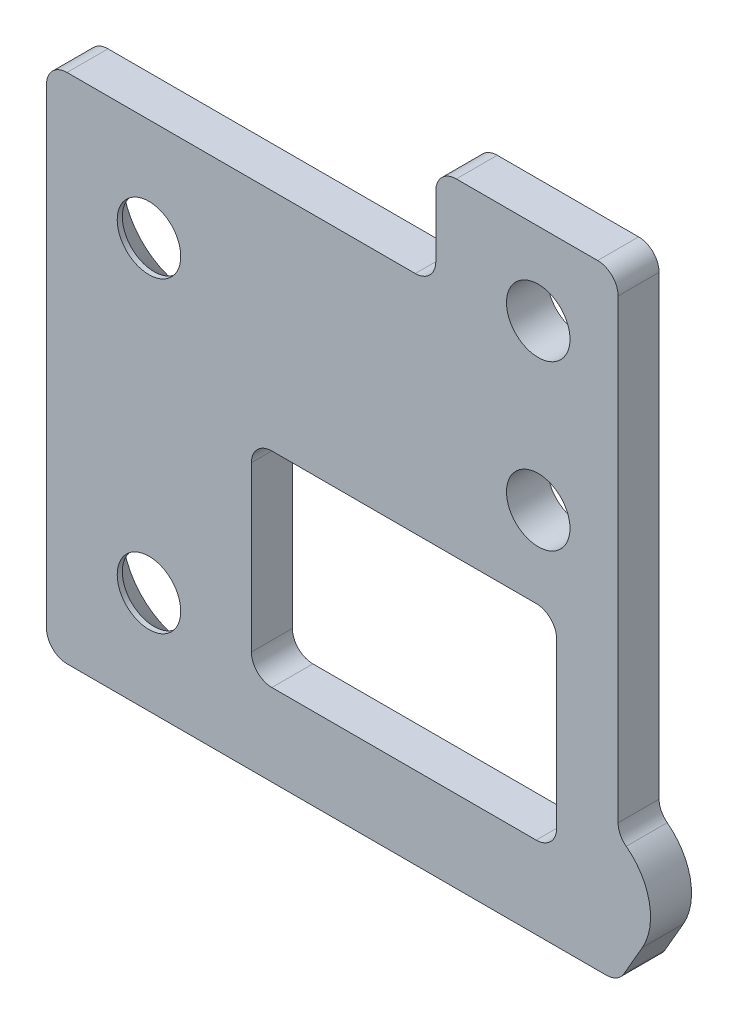
ISO-10303-21;
HEADER;
FILE_DESCRIPTION(('STEP AP214'),'2;1');
FILE_NAME('part.step','',(''),(''),'','','');
FILE_SCHEMA(('AUTOMOTIVE_DESIGN { 1 0 10303 214 1 1 1 1 }'));
ENDSEC;
DATA;
#1=APPLICATION_CONTEXT('core data for automotive mechanical design processes');
#2=APPLICATION_PROTOCOL_DEFINITION('international standard','automotive_design',2000,#1);
#3=PRODUCT_CONTEXT('',#1,'mechanical');
#4=PRODUCT('Part','Part','',(#3));
#5=PRODUCT_RELATED_PRODUCT_CATEGORY('part','',(#4));
#6=PRODUCT_DEFINITION_FORMATION('','',#4);
#7=PRODUCT_DEFINITION_CONTEXT('part definition',#1,'design');
#8=PRODUCT_DEFINITION('design','',#6,#7);
#9=PRODUCT_DEFINITION_SHAPE('','',#8);
#10=(LENGTH_UNIT() NAMED_UNIT(*) SI_UNIT(.MILLI.,.METRE.));
#11=(NAMED_UNIT(*) PLANE_ANGLE_UNIT() SI_UNIT($,.RADIAN.));
#12=(NAMED_UNIT(*) SI_UNIT($,.STERADIAN.) SOLID_ANGLE_UNIT());
#13=UNCERTAINTY_MEASURE_WITH_UNIT(LENGTH_MEASURE(1.E-05),#10,'distance_accuracy_value','');
#14=(GEOMETRIC_REPRESENTATION_CONTEXT(3) GLOBAL_UNCERTAINTY_ASSIGNED_CONTEXT((#13)) GLOBAL_UNIT_ASSIGNED_CONTEXT((#10,
#11,#12)) REPRESENTATION_CONTEXT('',''));
#15=CARTESIAN_POINT('',(0.,0.,0.));
#16=DIRECTION('',(0.,0.,1.));
#17=DIRECTION('',(1.,0.,0.));
#18=AXIS2_PLACEMENT_3D('',#15,#16,#17);
#19=CARTESIAN_POINT('',(0.,0.,0.));
#20=DIRECTION('',(0.,0.,1.));
#21=DIRECTION('',(1.,0.,0.));
#22=AXIS2_PLACEMENT_3D('',#19,#20,#21);
#23=PLANE('',#22);
#24=CARTESIAN_POINT('',(-4.49999999999999,-7.5,0.));
#25=DIRECTION('',(0.,0.,-1.));
#26=DIRECTION('',(-1.,0.,0.));
#27=AXIS2_PLACEMENT_3D('',#24,#25,#26);
#28=CIRCLE('',#27,3.3);
#29=CARTESIAN_POINT('',(-7.79999999999999,-7.5,0.));
#30=VERTEX_POINT('',#29);
#31=EDGE_CURVE('E688',#30,#30,#28,.T.);
#32=ORIENTED_EDGE('',*,*,#31,.F.);
#33=EDGE_LOOP('',(#32));
#34=FACE_BOUND('',#33,.T.);
#35=CARTESIAN_POINT('',(14.5,5.5,0.));
#36=DIRECTION('',(0.,0.,1.));
#37=DIRECTION('',(1.,0.,0.));
#38=AXIS2_PLACEMENT_3D('',#35,#36,#37);
#39=CIRCLE('',#38,1.55);
#40=CARTESIAN_POINT('',(16.05,5.5,0.));
#41=VERTEX_POINT('',#40);
#42=EDGE_CURVE('E670',#41,#41,#39,.T.);
#43=ORIENTED_EDGE('',*,*,#42,.T.);
#44=EDGE_LOOP('',(#43));
#45=FACE_BOUND('',#44,.T.);
#46=CARTESIAN_POINT('',(14.5,13.5,0.));
#47=DIRECTION('',(0.,0.,1.));
#48=DIRECTION('',(1.,0.,0.));
#49=AXIS2_PLACEMENT_3D('',#46,#47,#48);
#50=CIRCLE('',#49,1.55);
#51=CARTESIAN_POINT('',(16.05,13.5,0.));
#52=VERTEX_POINT('',#51);
#53=EDGE_CURVE('E356',#52,#52,#50,.T.);
#54=ORIENTED_EDGE('',*,*,#53,.T.);
#55=EDGE_LOOP('',(#54));
#56=FACE_BOUND('',#55,.T.);
#57=CARTESIAN_POINT('',(19.4,-5.76794919243113,0.));
#58=DIRECTION('',(0.,0.,1.));
#59=DIRECTION('',(1.,0.,0.));
#60=AXIS2_PLACEMENT_3D('',#57,#58,#59);
#61=CIRCLE('',#60,1.);
#62=CARTESIAN_POINT('',(18.4,-5.76794919243113,0.));
#63=VERTEX_POINT('',#62);
#64=CARTESIAN_POINT('',(18.7956684537023,-6.56468213523535,0.));
#65=VERTEX_POINT('',#64);
#66=EDGE_CURVE('E308',#63,#65,#61,.T.);
#67=ORIENTED_EDGE('',*,*,#66,.T.);
#68=CARTESIAN_POINT('',(16.9826738148093,-8.954880963648,0.));
#69=DIRECTION('',(0.,0.,1.));
#70=DIRECTION('',(1.,0.,0.));
#71=AXIS2_PLACEMENT_3D('',#68,#69,#70);
#72=CIRCLE('',#71,3.);
#73=CARTESIAN_POINT('',(19.5807500261627,-10.454880963648,0.));
#74=VERTEX_POINT('',#73);
#75=EDGE_CURVE('E56',#65,#74,#72,.F.);
#76=ORIENTED_EDGE('',*,*,#75,.T.);
#77=DIRECTION('',(0.499999999999998,0.86602540378444,0.));
#78=VECTOR('',#77,1.);
#79=CARTESIAN_POINT('',(18.4,-12.5,0.));
#80=LINE('',#79,#78);
#81=CARTESIAN_POINT('',(18.6886751345948,-12.,0.));
#82=VERTEX_POINT('',#81);
#83=EDGE_CURVE('E329',#82,#74,#80,.T.);
#84=ORIENTED_EDGE('',*,*,#83,.F.);
#85=CARTESIAN_POINT('',(17.8226497308104,-11.5,0.));
#86=DIRECTION('',(0.,0.,1.));
#87=DIRECTION('',(1.,0.,0.));
#88=AXIS2_PLACEMENT_3D('',#85,#86,#87);
#89=CIRCLE('',#88,1.);
#90=CARTESIAN_POINT('',(17.8226497308104,-12.5,0.));
#91=VERTEX_POINT('',#90);
#92=EDGE_CURVE('E253',#82,#91,#89,.F.);
#93=ORIENTED_EDGE('',*,*,#92,.T.);
#94=DIRECTION('',(1.,0.,0.));
#95=VECTOR('',#94,1.);
#96=CARTESIAN_POINT('',(9.5,-12.5,0.));
#97=LINE('',#96,#95);
#98=CARTESIAN_POINT('',(-8.49999999999999,-12.5,0.));
#99=VERTEX_POINT('',#98);
#100=EDGE_CURVE('E334',#99,#91,#97,.T.);
#101=ORIENTED_EDGE('',*,*,#100,.F.);
#102=CARTESIAN_POINT('',(-8.49999999999999,-11.5,0.));
#103=DIRECTION('',(0.,0.,1.));
#104=DIRECTION('',(1.,0.,0.));
#105=AXIS2_PLACEMENT_3D('',#102,#103,#104);
#106=CIRCLE('',#105,1.);
#107=CARTESIAN_POINT('',(-9.5,-11.5,0.));
#108=VERTEX_POINT('',#107);
#109=EDGE_CURVE('E251',#99,#108,#106,.F.);
#110=ORIENTED_EDGE('',*,*,#109,.T.);
#111=DIRECTION('',(0.,-1.,0.));
#112=VECTOR('',#111,1.);
#113=CARTESIAN_POINT('',(-9.5,-12.5,0.));
#114=LINE('',#113,#112);
#115=CARTESIAN_POINT('',(-9.49999999999999,11.5,0.));
#116=VERTEX_POINT('',#115);
#117=EDGE_CURVE('E368',#116,#108,#114,.T.);
#118=ORIENTED_EDGE('',*,*,#117,.F.);
#119=CARTESIAN_POINT('',(-8.49999999999999,11.5,0.));
#120=DIRECTION('',(0.,0.,1.));
#121=DIRECTION('',(1.,0.,0.));
#122=AXIS2_PLACEMENT_3D('',#119,#120,#121);
#123=CIRCLE('',#122,1.);
#124=CARTESIAN_POINT('',(-8.49999999999999,12.5,0.));
#125=VERTEX_POINT('',#124);
#126=EDGE_CURVE('E249',#116,#125,#123,.F.);
#127=ORIENTED_EDGE('',*,*,#126,.T.);
#128=DIRECTION('',(-1.,0.,0.));
#129=VECTOR('',#128,1.);
#130=CARTESIAN_POINT('',(9.5,12.5,0.));
#131=LINE('',#130,#129);
#132=CARTESIAN_POINT('',(8.5,12.5,0.));
#133=VERTEX_POINT('',#132);
#134=EDGE_CURVE('E223',#133,#125,#131,.T.);
#135=ORIENTED_EDGE('',*,*,#134,.F.);
#136=CARTESIAN_POINT('',(8.5,13.5,0.));
#137=DIRECTION('',(0.,0.,1.));
#138=DIRECTION('',(1.,0.,0.));
#139=AXIS2_PLACEMENT_3D('',#136,#137,#138);
#140=CIRCLE('',#139,1.);
#141=CARTESIAN_POINT('',(9.5,13.5,0.));
#142=VERTEX_POINT('',#141);
#143=EDGE_CURVE('E304',#133,#142,#140,.T.);
#144=ORIENTED_EDGE('',*,*,#143,.T.);
#145=DIRECTION('',(0.,-1.,0.));
#146=VECTOR('',#145,1.);
#147=CARTESIAN_POINT('',(9.5,12.5,0.));
#148=LINE('',#147,#146);
#149=CARTESIAN_POINT('',(9.5,16.5,0.));
#150=VERTEX_POINT('',#149);
#151=EDGE_CURVE('E332',#150,#142,#148,.T.);
#152=ORIENTED_EDGE('',*,*,#151,.F.);
#153=CARTESIAN_POINT('',(10.5,16.5,0.));
#154=DIRECTION('',(0.,0.,1.));
#155=DIRECTION('',(1.,0.,0.));
#156=AXIS2_PLACEMENT_3D('',#153,#154,#155);
#157=CIRCLE('',#156,1.);
#158=CARTESIAN_POINT('',(10.5,17.5,0.));
#159=VERTEX_POINT('',#158);
#160=EDGE_CURVE('E257',#150,#159,#157,.F.);
#161=ORIENTED_EDGE('',*,*,#160,.T.);
#162=DIRECTION('',(-1.,0.,0.));
#163=VECTOR('',#162,1.);
#164=CARTESIAN_POINT('',(9.5,17.5,0.));
#165=LINE('',#164,#163);
#166=CARTESIAN_POINT('',(17.4,17.5,0.));
#167=VERTEX_POINT('',#166);
#168=EDGE_CURVE('E328',#167,#159,#165,.T.);
#169=ORIENTED_EDGE('',*,*,#168,.F.);
#170=CARTESIAN_POINT('',(17.4,16.5,0.));
#171=DIRECTION('',(0.,0.,1.));
#172=DIRECTION('',(1.,0.,0.));
#173=AXIS2_PLACEMENT_3D('',#170,#171,#172);
#174=CIRCLE('',#173,1.);
#175=CARTESIAN_POINT('',(18.4,16.5,0.));
#176=VERTEX_POINT('',#175);
#177=EDGE_CURVE('E255',#167,#176,#174,.F.);
#178=ORIENTED_EDGE('',*,*,#177,.T.);
#179=DIRECTION('',(0.,1.,0.));
#180=VECTOR('',#179,1.);
#181=CARTESIAN_POINT('',(18.4,17.5,0.));
#182=LINE('',#181,#180);
#183=EDGE_CURVE('E324',#63,#176,#182,.T.);
#184=ORIENTED_EDGE('',*,*,#183,.F.);
#185=EDGE_LOOP('',(#67,#76,#84,#93,#101,#110,#118,#127,#135,#144,#152,#161,#169,#178,#184));
#186=FACE_BOUND('',#185,.T.);
#187=DIRECTION('',(-1.,0.,0.));
#188=VECTOR('',#187,1.);
#189=CARTESIAN_POINT('',(15.4,1.5,0.));
#190=LINE('',#189,#188);
#191=CARTESIAN_POINT('',(14.4,1.5,0.));
#192=VERTEX_POINT('',#191);
#193=CARTESIAN_POINT('',(1.50000000000001,1.5,0.));
#194=VERTEX_POINT('',#193);
#195=EDGE_CURVE('E637',#192,#194,#190,.T.);
#196=ORIENTED_EDGE('',*,*,#195,.T.);
#197=CARTESIAN_POINT('',(1.50000000000001,0.5,0.));
#198=DIRECTION('',(0.,0.,1.));
#199=DIRECTION('',(1.,0.,0.));
#200=AXIS2_PLACEMENT_3D('',#197,#198,#199);
#201=CIRCLE('',#200,1.);
#202=CARTESIAN_POINT('',(0.500000000000006,0.5,0.));
#203=VERTEX_POINT('',#202);
#204=EDGE_CURVE('E300',#194,#203,#201,.T.);
#205=ORIENTED_EDGE('',*,*,#204,.T.);
#206=DIRECTION('',(0.,-1.,0.));
#207=VECTOR('',#206,1.);
#208=CARTESIAN_POINT('',(0.500000000000006,-8.5,0.));
#209=LINE('',#208,#207);
#210=CARTESIAN_POINT('',(0.500000000000006,-7.5,0.));
#211=VERTEX_POINT('',#210);
#212=EDGE_CURVE('E195',#203,#211,#209,.T.);
#213=ORIENTED_EDGE('',*,*,#212,.T.);
#214=CARTESIAN_POINT('',(1.50000000000001,-7.5,0.));
#215=DIRECTION('',(0.,0.,1.));
#216=DIRECTION('',(1.,0.,0.));
#217=AXIS2_PLACEMENT_3D('',#214,#215,#216);
#218=CIRCLE('',#217,1.);
#219=CARTESIAN_POINT('',(1.50000000000001,-8.5,0.));
#220=VERTEX_POINT('',#219);
#221=EDGE_CURVE('E189',#211,#220,#218,.T.);
#222=ORIENTED_EDGE('',*,*,#221,.T.);
#223=DIRECTION('',(1.,0.,0.));
#224=VECTOR('',#223,1.);
#225=CARTESIAN_POINT('',(15.4,-8.5,0.));
#226=LINE('',#225,#224);
#227=CARTESIAN_POINT('',(14.4,-8.5,0.));
#228=VERTEX_POINT('',#227);
#229=EDGE_CURVE('E193',#220,#228,#226,.T.);
#230=ORIENTED_EDGE('',*,*,#229,.T.);
#231=CARTESIAN_POINT('',(14.4,-7.5,0.));
#232=DIRECTION('',(0.,0.,1.));
#233=DIRECTION('',(1.,0.,0.));
#234=AXIS2_PLACEMENT_3D('',#231,#232,#233);
#235=CIRCLE('',#234,1.);
#236=CARTESIAN_POINT('',(15.4,-7.5,0.));
#237=VERTEX_POINT('',#236);
#238=EDGE_CURVE('E292',#228,#237,#235,.T.);
#239=ORIENTED_EDGE('',*,*,#238,.T.);
#240=DIRECTION('',(0.,1.,0.));
#241=VECTOR('',#240,1.);
#242=CARTESIAN_POINT('',(15.4,-8.5,0.));
#243=LINE('',#242,#241);
#244=CARTESIAN_POINT('',(15.4,0.5,0.));
#245=VERTEX_POINT('',#244);
#246=EDGE_CURVE('E211',#237,#245,#243,.T.);
#247=ORIENTED_EDGE('',*,*,#246,.T.);
#248=CARTESIAN_POINT('',(14.4,0.5,0.));
#249=DIRECTION('',(0.,0.,1.));
#250=DIRECTION('',(1.,0.,0.));
#251=AXIS2_PLACEMENT_3D('',#248,#249,#250);
#252=CIRCLE('',#251,1.);
#253=EDGE_CURVE('E296',#245,#192,#252,.T.);
#254=ORIENTED_EDGE('',*,*,#253,.T.);
#255=EDGE_LOOP('',(#196,#205,#213,#222,#230,#239,#247,#254));
#256=FACE_BOUND('',#255,.T.);
#257=CARTESIAN_POINT('',(-4.5,7.5,0.));
#258=DIRECTION('',(0.,0.,-1.));
#259=DIRECTION('',(-1.,0.,0.));
#260=AXIS2_PLACEMENT_3D('',#257,#258,#259);
#261=CIRCLE('',#260,3.3);
#262=CARTESIAN_POINT('',(-7.8,7.5,0.));
#263=VERTEX_POINT('',#262);
#264=EDGE_CURVE('E700',#263,#263,#261,.T.);
#265=ORIENTED_EDGE('',*,*,#264,.F.);
#266=EDGE_LOOP('',(#265));
#267=FACE_BOUND('',#266,.T.);
#268=ADVANCED_FACE('F34',(#34,#45,#56,#186,#256,#267),#23,.F.);
#269=CARTESIAN_POINT('',(-4.49999999999999,-7.5,2.));
#270=DIRECTION('',(0.,0.,-1.));
#271=DIRECTION('',(-1.,0.,0.));
#272=AXIS2_PLACEMENT_3D('',#269,#270,#271);
#273=CYLINDRICAL_SURFACE('',#272,1.55);
#274=CARTESIAN_POINT('',(-4.49999999999999,-7.5,2.));
#275=DIRECTION('',(0.,0.,1.));
#276=DIRECTION('',(-1.,0.,0.));
#277=AXIS2_PLACEMENT_3D('',#274,#275,#276);
#278=CIRCLE('',#277,1.55);
#279=CARTESIAN_POINT('',(-6.04999999999999,-7.5,2.));
#280=VERTEX_POINT('',#279);
#281=EDGE_CURVE('E657',#280,#280,#278,.T.);
#282=ORIENTED_EDGE('',*,*,#281,.T.);
#283=EDGE_LOOP('',(#282));
#284=FACE_BOUND('',#283,.T.);
#285=CARTESIAN_POINT('',(-4.49999999999999,-7.5,1.75));
#286=DIRECTION('',(0.,0.,-1.));
#287=DIRECTION('',(-1.,0.,0.));
#288=AXIS2_PLACEMENT_3D('',#285,#286,#287);
#289=CIRCLE('',#288,1.55);
#290=CARTESIAN_POINT('',(-6.04999999999999,-7.5,1.75));
#291=VERTEX_POINT('',#290);
#292=EDGE_CURVE('E662',#291,#291,#289,.T.);
#293=ORIENTED_EDGE('',*,*,#292,.T.);
#294=EDGE_LOOP('',(#293));
#295=FACE_BOUND('',#294,.T.);
#296=ADVANCED_FACE('F426',(#284,#295),#273,.F.);
#297=CARTESIAN_POINT('',(0.,0.,2.));
#298=DIRECTION('',(0.,0.,1.));
#299=DIRECTION('',(1.,0.,0.));
#300=AXIS2_PLACEMENT_3D('',#297,#298,#299);
#301=PLANE('',#300);
#302=CARTESIAN_POINT('',(-4.5,7.5,2.));
#303=DIRECTION('',(0.,0.,1.));
#304=DIRECTION('',(1.,0.,0.));
#305=AXIS2_PLACEMENT_3D('',#302,#303,#304);
#306=CIRCLE('',#305,1.55);
#307=CARTESIAN_POINT('',(-2.94999999999999,7.5,2.));
#308=VERTEX_POINT('',#307);
#309=EDGE_CURVE('E667',#308,#308,#306,.T.);
#310=ORIENTED_EDGE('',*,*,#309,.F.);
#311=EDGE_LOOP('',(#310));
#312=FACE_BOUND('',#311,.T.);
#313=CARTESIAN_POINT('',(14.5,13.5,2.));
#314=DIRECTION('',(0.,0.,1.));
#315=DIRECTION('',(1.,0.,0.));
#316=AXIS2_PLACEMENT_3D('',#313,#314,#315);
#317=CIRCLE('',#316,1.55);
#318=CARTESIAN_POINT('',(16.05,13.5,2.));
#319=VERTEX_POINT('',#318);
#320=EDGE_CURVE('E370',#319,#319,#317,.T.);
#321=ORIENTED_EDGE('',*,*,#320,.F.);
#322=EDGE_LOOP('',(#321));
#323=FACE_BOUND('',#322,.T.);
#324=DIRECTION('',(0.499999999999998,0.86602540378444,0.));
#325=VECTOR('',#324,1.);
#326=CARTESIAN_POINT('',(18.4,-12.5,2.));
#327=LINE('',#326,#325);
#328=CARTESIAN_POINT('',(18.6886751345948,-12.,2.));
#329=VERTEX_POINT('',#328);
#330=CARTESIAN_POINT('',(19.5807500261627,-10.454880963648,2.));
#331=VERTEX_POINT('',#330);
#332=EDGE_CURVE('E353',#329,#331,#327,.T.);
#333=ORIENTED_EDGE('',*,*,#332,.T.);
#334=CARTESIAN_POINT('',(16.9826738148093,-8.954880963648,2.));
#335=DIRECTION('',(0.,0.,1.));
#336=DIRECTION('',(1.,0.,0.));
#337=AXIS2_PLACEMENT_3D('',#334,#335,#336);
#338=CIRCLE('',#337,3.);
#339=CARTESIAN_POINT('',(18.7956684537023,-6.56468213523535,2.));
#340=VERTEX_POINT('',#339);
#341=EDGE_CURVE('E11',#331,#340,#338,.T.);
#342=ORIENTED_EDGE('',*,*,#341,.T.);
#343=CARTESIAN_POINT('',(19.4,-5.76794919243113,2.));
#344=DIRECTION('',(0.,0.,1.));
#345=DIRECTION('',(1.,0.,0.));
#346=AXIS2_PLACEMENT_3D('',#343,#344,#345);
#347=CIRCLE('',#346,1.);
#348=CARTESIAN_POINT('',(18.4,-5.76794919243113,2.));
#349=VERTEX_POINT('',#348);
#350=EDGE_CURVE('E310',#340,#349,#347,.F.);
#351=ORIENTED_EDGE('',*,*,#350,.T.);
#352=DIRECTION('',(0.,1.,0.));
#353=VECTOR('',#352,1.);
#354=CARTESIAN_POINT('',(18.4,2.5,2.));
#355=LINE('',#354,#353);
#356=CARTESIAN_POINT('',(18.4,16.5,2.));
#357=VERTEX_POINT('',#356);
#358=EDGE_CURVE('E360',#349,#357,#355,.T.);
#359=ORIENTED_EDGE('',*,*,#358,.T.);
#360=CARTESIAN_POINT('',(17.4,16.5,2.));
#361=DIRECTION('',(0.,0.,1.));
#362=DIRECTION('',(1.,0.,0.));
#363=AXIS2_PLACEMENT_3D('',#360,#361,#362);
#364=CIRCLE('',#363,1.);
#365=CARTESIAN_POINT('',(17.4,17.5,2.));
#366=VERTEX_POINT('',#365);
#367=EDGE_CURVE('E270',#357,#366,#364,.T.);
#368=ORIENTED_EDGE('',*,*,#367,.T.);
#369=DIRECTION('',(-1.,0.,0.));
#370=VECTOR('',#369,1.);
#371=CARTESIAN_POINT('',(9.5,17.5,2.));
#372=LINE('',#371,#370);
#373=CARTESIAN_POINT('',(10.5,17.5,2.));
#374=VERTEX_POINT('',#373);
#375=EDGE_CURVE('E363',#366,#374,#372,.T.);
#376=ORIENTED_EDGE('',*,*,#375,.T.);
#377=CARTESIAN_POINT('',(10.5,16.5,2.));
#378=DIRECTION('',(0.,0.,1.));
#379=DIRECTION('',(1.,0.,0.));
#380=AXIS2_PLACEMENT_3D('',#377,#378,#379);
#381=CIRCLE('',#380,1.);
#382=CARTESIAN_POINT('',(9.5,16.5,2.));
#383=VERTEX_POINT('',#382);
#384=EDGE_CURVE('E272',#374,#383,#381,.T.);
#385=ORIENTED_EDGE('',*,*,#384,.T.);
#386=DIRECTION('',(0.,-1.,0.));
#387=VECTOR('',#386,1.);
#388=CARTESIAN_POINT('',(9.5,12.5,2.));
#389=LINE('',#388,#387);
#390=CARTESIAN_POINT('',(9.5,13.5,2.));
#391=VERTEX_POINT('',#390);
#392=EDGE_CURVE('E220',#383,#391,#389,.T.);
#393=ORIENTED_EDGE('',*,*,#392,.T.);
#394=CARTESIAN_POINT('',(8.5,13.5,2.));
#395=DIRECTION('',(0.,0.,1.));
#396=DIRECTION('',(1.,0.,0.));
#397=AXIS2_PLACEMENT_3D('',#394,#395,#396);
#398=CIRCLE('',#397,1.);
#399=CARTESIAN_POINT('',(8.5,12.5,2.));
#400=VERTEX_POINT('',#399);
#401=EDGE_CURVE('E306',#391,#400,#398,.F.);
#402=ORIENTED_EDGE('',*,*,#401,.T.);
#403=DIRECTION('',(-1.,0.,0.));
#404=VECTOR('',#403,1.);
#405=CARTESIAN_POINT('',(9.5,12.5,2.));
#406=LINE('',#405,#404);
#407=CARTESIAN_POINT('',(-8.49999999999999,12.5,2.));
#408=VERTEX_POINT('',#407);
#409=EDGE_CURVE('E215',#400,#408,#406,.T.);
#410=ORIENTED_EDGE('',*,*,#409,.T.);
#411=CARTESIAN_POINT('',(-8.49999999999999,11.5,2.));
#412=DIRECTION('',(0.,0.,1.));
#413=DIRECTION('',(1.,0.,0.));
#414=AXIS2_PLACEMENT_3D('',#411,#412,#413);
#415=CIRCLE('',#414,1.);
#416=CARTESIAN_POINT('',(-9.49999999999999,11.5,2.));
#417=VERTEX_POINT('',#416);
#418=EDGE_CURVE('E264',#408,#417,#415,.T.);
#419=ORIENTED_EDGE('',*,*,#418,.T.);
#420=DIRECTION('',(0.,-1.,0.));
#421=VECTOR('',#420,1.);
#422=CARTESIAN_POINT('',(-9.5,-12.5,2.));
#423=LINE('',#422,#421);
#424=CARTESIAN_POINT('',(-9.5,-11.5,2.));
#425=VERTEX_POINT('',#424);
#426=EDGE_CURVE('E342',#417,#425,#423,.T.);
#427=ORIENTED_EDGE('',*,*,#426,.T.);
#428=CARTESIAN_POINT('',(-8.49999999999999,-11.5,2.));
#429=DIRECTION('',(0.,0.,1.));
#430=DIRECTION('',(1.,0.,0.));
#431=AXIS2_PLACEMENT_3D('',#428,#429,#430);
#432=CIRCLE('',#431,1.);
#433=CARTESIAN_POINT('',(-8.49999999999999,-12.5,2.));
#434=VERTEX_POINT('',#433);
#435=EDGE_CURVE('E266',#425,#434,#432,.T.);
#436=ORIENTED_EDGE('',*,*,#435,.T.);
#437=DIRECTION('',(1.,0.,0.));
#438=VECTOR('',#437,1.);
#439=CARTESIAN_POINT('',(9.5,-12.5,2.));
#440=LINE('',#439,#438);
#441=CARTESIAN_POINT('',(17.8226497308104,-12.5,2.));
#442=VERTEX_POINT('',#441);
#443=EDGE_CURVE('E347',#434,#442,#440,.T.);
#444=ORIENTED_EDGE('',*,*,#443,.T.);
#445=CARTESIAN_POINT('',(17.8226497308104,-11.5,2.));
#446=DIRECTION('',(0.,0.,1.));
#447=DIRECTION('',(1.,0.,0.));
#448=AXIS2_PLACEMENT_3D('',#445,#446,#447);
#449=CIRCLE('',#448,1.);
#450=EDGE_CURVE('E268',#442,#329,#449,.T.);
#451=ORIENTED_EDGE('',*,*,#450,.T.);
#452=EDGE_LOOP('',(#333,#342,#351,#359,#368,#376,#385,#393,#402,#410,#419,#427,#436,#444,#451));
#453=FACE_BOUND('',#452,.T.);
#454=CARTESIAN_POINT('',(14.5,5.5,2.));
#455=DIRECTION('',(0.,0.,1.));
#456=DIRECTION('',(1.,0.,0.));
#457=AXIS2_PLACEMENT_3D('',#454,#455,#456);
#458=CIRCLE('',#457,1.55);
#459=CARTESIAN_POINT('',(16.05,5.5,2.));
#460=VERTEX_POINT('',#459);
#461=EDGE_CURVE('E671',#460,#460,#458,.T.);
#462=ORIENTED_EDGE('',*,*,#461,.F.);
#463=EDGE_LOOP('',(#462));
#464=FACE_BOUND('',#463,.T.);
#465=ORIENTED_EDGE('',*,*,#281,.F.);
#466=EDGE_LOOP('',(#465));
#467=FACE_BOUND('',#466,.T.);
#468=DIRECTION('',(1.,0.,0.));
#469=VECTOR('',#468,1.);
#470=CARTESIAN_POINT('',(15.4,-8.5,2.));
#471=LINE('',#470,#469);
#472=CARTESIAN_POINT('',(1.50000000000001,-8.5,2.));
#473=VERTEX_POINT('',#472);
#474=CARTESIAN_POINT('',(14.4,-8.5,2.));
#475=VERTEX_POINT('',#474);
#476=EDGE_CURVE('E655',#473,#475,#471,.T.);
#477=ORIENTED_EDGE('',*,*,#476,.F.);
#478=CARTESIAN_POINT('',(1.50000000000001,-7.5,2.));
#479=DIRECTION('',(0.,0.,1.));
#480=DIRECTION('',(1.,0.,0.));
#481=AXIS2_PLACEMENT_3D('',#478,#479,#480);
#482=CIRCLE('',#481,1.);
#483=CARTESIAN_POINT('',(0.500000000000006,-7.5,2.));
#484=VERTEX_POINT('',#483);
#485=EDGE_CURVE('E200',#473,#484,#482,.F.);
#486=ORIENTED_EDGE('',*,*,#485,.T.);
#487=DIRECTION('',(0.,-1.,0.));
#488=VECTOR('',#487,1.);
#489=CARTESIAN_POINT('',(0.500000000000006,-8.5,2.));
#490=LINE('',#489,#488);
#491=CARTESIAN_POINT('',(0.500000000000006,0.5,2.));
#492=VERTEX_POINT('',#491);
#493=EDGE_CURVE('E642',#492,#484,#490,.T.);
#494=ORIENTED_EDGE('',*,*,#493,.F.);
#495=CARTESIAN_POINT('',(1.50000000000001,0.5,2.));
#496=DIRECTION('',(0.,0.,1.));
#497=DIRECTION('',(1.,0.,0.));
#498=AXIS2_PLACEMENT_3D('',#495,#496,#497);
#499=CIRCLE('',#498,1.);
#500=CARTESIAN_POINT('',(1.50000000000001,1.5,2.));
#501=VERTEX_POINT('',#500);
#502=EDGE_CURVE('E302',#492,#501,#499,.F.);
#503=ORIENTED_EDGE('',*,*,#502,.T.);
#504=DIRECTION('',(-1.,0.,0.));
#505=VECTOR('',#504,1.);
#506=CARTESIAN_POINT('',(15.4,1.5,2.));
#507=LINE('',#506,#505);
#508=CARTESIAN_POINT('',(14.4,1.5,2.));
#509=VERTEX_POINT('',#508);
#510=EDGE_CURVE('E651',#509,#501,#507,.T.);
#511=ORIENTED_EDGE('',*,*,#510,.F.);
#512=CARTESIAN_POINT('',(14.4,0.5,2.));
#513=DIRECTION('',(0.,0.,1.));
#514=DIRECTION('',(1.,0.,0.));
#515=AXIS2_PLACEMENT_3D('',#512,#513,#514);
#516=CIRCLE('',#515,1.);
#517=CARTESIAN_POINT('',(15.4,0.5,2.));
#518=VERTEX_POINT('',#517);
#519=EDGE_CURVE('E201',#509,#518,#516,.F.);
#520=ORIENTED_EDGE('',*,*,#519,.T.);
#521=DIRECTION('',(0.,1.,0.));
#522=VECTOR('',#521,1.);
#523=CARTESIAN_POINT('',(15.4,-8.5,2.));
#524=LINE('',#523,#522);
#525=CARTESIAN_POINT('',(15.4,-7.5,2.));
#526=VERTEX_POINT('',#525);
#527=EDGE_CURVE('E649',#526,#518,#524,.T.);
#528=ORIENTED_EDGE('',*,*,#527,.F.);
#529=CARTESIAN_POINT('',(14.4,-7.5,2.));
#530=DIRECTION('',(0.,0.,1.));
#531=DIRECTION('',(1.,0.,0.));
#532=AXIS2_PLACEMENT_3D('',#529,#530,#531);
#533=CIRCLE('',#532,1.);
#534=EDGE_CURVE('E294',#526,#475,#533,.F.);
#535=ORIENTED_EDGE('',*,*,#534,.T.);
#536=EDGE_LOOP('',(#477,#486,#494,#503,#511,#520,#528,#535));
#537=FACE_BOUND('',#536,.T.);
#538=ADVANCED_FACE('F382',(#312,#323,#453,#464,#467,#537),#301,.T.);
#539=CARTESIAN_POINT('',(-9.5,-12.5,2.));
#540=DIRECTION('',(1.,0.,0.));
#541=DIRECTION('',(0.,1.,0.));
#542=AXIS2_PLACEMENT_3D('',#539,#540,#541);
#543=PLANE('',#542);
#544=ORIENTED_EDGE('',*,*,#117,.T.);
#545=DIRECTION('',(0.,0.,-1.));
#546=VECTOR('',#545,1.);
#547=CARTESIAN_POINT('',(-9.5,-11.5,2.));
#548=LINE('',#547,#546);
#549=EDGE_CURVE('E290',#108,#425,#548,.F.);
#550=ORIENTED_EDGE('',*,*,#549,.T.);
#551=ORIENTED_EDGE('',*,*,#426,.F.);
#552=DIRECTION('',(0.,0.,-1.));
#553=VECTOR('',#552,1.);
#554=CARTESIAN_POINT('',(-9.49999999999999,11.5,2.));
#555=LINE('',#554,#553);
#556=EDGE_CURVE('E287',#417,#116,#555,.T.);
#557=ORIENTED_EDGE('',*,*,#556,.T.);
#558=EDGE_LOOP('',(#544,#550,#551,#557));
#559=FACE_BOUND('',#558,.T.);
#560=ADVANCED_FACE('F412',(#559),#543,.F.);
#561=CARTESIAN_POINT('',(9.5,-12.5,2.));
#562=DIRECTION('',(0.,1.,0.));
#563=DIRECTION('',(0.,0.,1.));
#564=AXIS2_PLACEMENT_3D('',#561,#562,#563);
#565=PLANE('',#564);
#566=ORIENTED_EDGE('',*,*,#100,.T.);
#567=DIRECTION('',(0.,0.,-1.));
#568=VECTOR('',#567,1.);
#569=CARTESIAN_POINT('',(17.8226497308104,-12.5,2.));
#570=LINE('',#569,#568);
#571=EDGE_CURVE('E285',#91,#442,#570,.F.);
#572=ORIENTED_EDGE('',*,*,#571,.T.);
#573=ORIENTED_EDGE('',*,*,#443,.F.);
#574=DIRECTION('',(0.,0.,-1.));
#575=VECTOR('',#574,1.);
#576=CARTESIAN_POINT('',(-8.49999999999999,-12.5,2.));
#577=LINE('',#576,#575);
#578=EDGE_CURVE('E282',#434,#99,#577,.T.);
#579=ORIENTED_EDGE('',*,*,#578,.T.);
#580=EDGE_LOOP('',(#566,#572,#573,#579));
#581=FACE_BOUND('',#580,.T.);
#582=ADVANCED_FACE('F375',(#581),#565,.F.);
#583=CARTESIAN_POINT('',(18.4,-12.5,2.));
#584=DIRECTION('',(-0.86602540378444,0.499999999999998,0.));
#585=DIRECTION('',(-0.499999999999998,-0.86602540378444,0.));
#586=AXIS2_PLACEMENT_3D('',#583,#584,#585);
#587=PLANE('',#586);
#588=ORIENTED_EDGE('',*,*,#83,.T.);
#589=DIRECTION('',(0.,0.,1.));
#590=VECTOR('',#589,1.);
#591=CARTESIAN_POINT('',(19.5807500261627,-10.454880963648,2.));
#592=LINE('',#591,#590);
#593=EDGE_CURVE('E42',#74,#331,#592,.T.);
#594=ORIENTED_EDGE('',*,*,#593,.T.);
#595=ORIENTED_EDGE('',*,*,#332,.F.);
#596=DIRECTION('',(0.,0.,-1.));
#597=VECTOR('',#596,1.);
#598=CARTESIAN_POINT('',(18.6886751345948,-12.,2.));
#599=LINE('',#598,#597);
#600=EDGE_CURVE('E279',#329,#82,#599,.T.);
#601=ORIENTED_EDGE('',*,*,#600,.T.);
#602=EDGE_LOOP('',(#588,#594,#595,#601));
#603=FACE_BOUND('',#602,.T.);
#604=ADVANCED_FACE('F384',(#603),#587,.F.);
#605=CARTESIAN_POINT('',(18.4,17.5,2.));
#606=DIRECTION('',(-1.,0.,0.));
#607=DIRECTION('',(0.,-1.,0.));
#608=AXIS2_PLACEMENT_3D('',#605,#606,#607);
#609=PLANE('',#608);
#610=ORIENTED_EDGE('',*,*,#183,.T.);
#611=DIRECTION('',(0.,0.,-1.));
#612=VECTOR('',#611,1.);
#613=CARTESIAN_POINT('',(18.4,16.5,2.));
#614=LINE('',#613,#612);
#615=EDGE_CURVE('E277',#176,#357,#614,.F.);
#616=ORIENTED_EDGE('',*,*,#615,.T.);
#617=ORIENTED_EDGE('',*,*,#358,.F.);
#618=DIRECTION('',(0.,0.,-1.));
#619=VECTOR('',#618,1.);
#620=CARTESIAN_POINT('',(18.4,-5.76794919243113,0.));
#621=LINE('',#620,#619);
#622=EDGE_CURVE('E274',#349,#63,#621,.T.);
#623=ORIENTED_EDGE('',*,*,#622,.T.);
#624=EDGE_LOOP('',(#610,#616,#617,#623));
#625=FACE_BOUND('',#624,.T.);
#626=ADVANCED_FACE('F387',(#625),#609,.F.);
#627=CARTESIAN_POINT('',(9.5,17.5,2.));
#628=DIRECTION('',(0.,-1.,0.));
#629=DIRECTION('',(0.,0.,-1.));
#630=AXIS2_PLACEMENT_3D('',#627,#628,#629);
#631=PLANE('',#630);
#632=ORIENTED_EDGE('',*,*,#168,.T.);
#633=DIRECTION('',(0.,0.,-1.));
#634=VECTOR('',#633,1.);
#635=CARTESIAN_POINT('',(10.5,17.5,2.));
#636=LINE('',#635,#634);
#637=EDGE_CURVE('E262',#159,#374,#636,.F.);
#638=ORIENTED_EDGE('',*,*,#637,.T.);
#639=ORIENTED_EDGE('',*,*,#375,.F.);
#640=DIRECTION('',(0.,0.,-1.));
#641=VECTOR('',#640,1.);
#642=CARTESIAN_POINT('',(17.4,17.5,2.));
#643=LINE('',#642,#641);
#644=EDGE_CURVE('E259',#366,#167,#643,.T.);
#645=ORIENTED_EDGE('',*,*,#644,.T.);
#646=EDGE_LOOP('',(#632,#638,#639,#645));
#647=FACE_BOUND('',#646,.T.);
#648=ADVANCED_FACE('F394',(#647),#631,.F.);
#649=CARTESIAN_POINT('',(9.5,12.5,2.));
#650=DIRECTION('',(1.,0.,0.));
#651=DIRECTION('',(0.,0.,-1.));
#652=AXIS2_PLACEMENT_3D('',#649,#650,#651);
#653=PLANE('',#652);
#654=ORIENTED_EDGE('',*,*,#151,.T.);
#655=DIRECTION('',(0.,0.,-1.));
#656=VECTOR('',#655,1.);
#657=CARTESIAN_POINT('',(9.5,13.5,2.));
#658=LINE('',#657,#656);
#659=EDGE_CURVE('E247',#142,#391,#658,.F.);
#660=ORIENTED_EDGE('',*,*,#659,.T.);
#661=ORIENTED_EDGE('',*,*,#392,.F.);
#662=DIRECTION('',(0.,0.,-1.));
#663=VECTOR('',#662,1.);
#664=CARTESIAN_POINT('',(9.5,16.5,2.));
#665=LINE('',#664,#663);
#666=EDGE_CURVE('E244',#383,#150,#665,.T.);
#667=ORIENTED_EDGE('',*,*,#666,.T.);
#668=EDGE_LOOP('',(#654,#660,#661,#667));
#669=FACE_BOUND('',#668,.T.);
#670=ADVANCED_FACE('F401',(#669),#653,.F.);
#671=CARTESIAN_POINT('',(9.5,12.5,2.));
#672=DIRECTION('',(0.,-1.,0.));
#673=DIRECTION('',(1.,0.,0.));
#674=AXIS2_PLACEMENT_3D('',#671,#672,#673);
#675=PLANE('',#674);
#676=ORIENTED_EDGE('',*,*,#409,.F.);
#677=DIRECTION('',(0.,0.,-1.));
#678=VECTOR('',#677,1.);
#679=CARTESIAN_POINT('',(8.5,12.5,0.));
#680=LINE('',#679,#678);
#681=EDGE_CURVE('E241',#400,#133,#680,.T.);
#682=ORIENTED_EDGE('',*,*,#681,.T.);
#683=ORIENTED_EDGE('',*,*,#134,.T.);
#684=DIRECTION('',(0.,0.,-1.));
#685=VECTOR('',#684,1.);
#686=CARTESIAN_POINT('',(-8.49999999999999,12.5,2.));
#687=LINE('',#686,#685);
#688=EDGE_CURVE('E239',#125,#408,#687,.F.);
#689=ORIENTED_EDGE('',*,*,#688,.T.);
#690=EDGE_LOOP('',(#676,#682,#683,#689));
#691=FACE_BOUND('',#690,.T.);
#692=ADVANCED_FACE('F407',(#691),#675,.F.);
#693=CARTESIAN_POINT('',(14.5,13.5,2.));
#694=DIRECTION('',(0.,0.,-1.));
#695=DIRECTION('',(-1.,0.,0.));
#696=AXIS2_PLACEMENT_3D('',#693,#694,#695);
#697=CYLINDRICAL_SURFACE('',#696,1.55);
#698=ORIENTED_EDGE('',*,*,#320,.T.);
#699=EDGE_LOOP('',(#698));
#700=FACE_BOUND('',#699,.T.);
#701=ORIENTED_EDGE('',*,*,#53,.F.);
#702=EDGE_LOOP('',(#701));
#703=FACE_BOUND('',#702,.T.);
#704=ADVANCED_FACE('F441',(#700,#703),#697,.F.);
#705=CARTESIAN_POINT('',(14.5,5.5,2.));
#706=DIRECTION('',(0.,0.,-1.));
#707=DIRECTION('',(-1.,0.,0.));
#708=AXIS2_PLACEMENT_3D('',#705,#706,#707);
#709=CYLINDRICAL_SURFACE('',#708,1.55);
#710=ORIENTED_EDGE('',*,*,#461,.T.);
#711=EDGE_LOOP('',(#710));
#712=FACE_BOUND('',#711,.T.);
#713=ORIENTED_EDGE('',*,*,#42,.F.);
#714=EDGE_LOOP('',(#713));
#715=FACE_BOUND('',#714,.T.);
#716=ADVANCED_FACE('F519',(#712,#715),#709,.F.);
#717=CARTESIAN_POINT('',(-4.5,7.5,2.));
#718=DIRECTION('',(0.,0.,-1.));
#719=DIRECTION('',(-1.,0.,0.));
#720=AXIS2_PLACEMENT_3D('',#717,#718,#719);
#721=CYLINDRICAL_SURFACE('',#720,1.55);
#722=CARTESIAN_POINT('',(-4.5,7.5,1.75));
#723=DIRECTION('',(0.,0.,-1.));
#724=DIRECTION('',(-1.,0.,0.));
#725=AXIS2_PLACEMENT_3D('',#722,#723,#724);
#726=CIRCLE('',#725,1.55);
#727=CARTESIAN_POINT('',(-6.04999999999999,7.5,1.75));
#728=VERTEX_POINT('',#727);
#729=EDGE_CURVE('E691',#728,#728,#726,.T.);
#730=ORIENTED_EDGE('',*,*,#729,.T.);
#731=EDGE_LOOP('',(#730));
#732=FACE_BOUND('',#731,.T.);
#733=ORIENTED_EDGE('',*,*,#309,.T.);
#734=EDGE_LOOP('',(#733));
#735=FACE_BOUND('',#734,.T.);
#736=ADVANCED_FACE('F513',(#732,#735),#721,.F.);
#737=CARTESIAN_POINT('',(0.500000000000006,-8.5,2.));
#738=DIRECTION('',(1.,0.,0.));
#739=DIRECTION('',(0.,0.,-1.));
#740=AXIS2_PLACEMENT_3D('',#737,#738,#739);
#741=PLANE('',#740);
#742=ORIENTED_EDGE('',*,*,#493,.T.);
#743=DIRECTION('',(0.,0.,-1.));
#744=VECTOR('',#743,1.);
#745=CARTESIAN_POINT('',(0.500000000000006,-7.5,0.));
#746=LINE('',#745,#744);
#747=EDGE_CURVE('E237',#484,#211,#746,.T.);
#748=ORIENTED_EDGE('',*,*,#747,.T.);
#749=ORIENTED_EDGE('',*,*,#212,.F.);
#750=DIRECTION('',(0.,0.,-1.));
#751=VECTOR('',#750,1.);
#752=CARTESIAN_POINT('',(0.500000000000006,0.5,2.));
#753=LINE('',#752,#751);
#754=EDGE_CURVE('E235',#203,#492,#753,.F.);
#755=ORIENTED_EDGE('',*,*,#754,.T.);
#756=EDGE_LOOP('',(#742,#748,#749,#755));
#757=FACE_BOUND('',#756,.T.);
#758=ADVANCED_FACE('F518',(#757),#741,.T.);
#759=CARTESIAN_POINT('',(15.4,-8.5,2.));
#760=DIRECTION('',(0.,1.,0.));
#761=DIRECTION('',(-1.,0.,0.));
#762=AXIS2_PLACEMENT_3D('',#759,#760,#761);
#763=PLANE('',#762);
#764=ORIENTED_EDGE('',*,*,#476,.T.);
#765=DIRECTION('',(0.,0.,-1.));
#766=VECTOR('',#765,1.);
#767=CARTESIAN_POINT('',(14.4,-8.5,0.));
#768=LINE('',#767,#766);
#769=EDGE_CURVE('E210',#475,#228,#768,.T.);
#770=ORIENTED_EDGE('',*,*,#769,.T.);
#771=ORIENTED_EDGE('',*,*,#229,.F.);
#772=DIRECTION('',(0.,0.,-1.));
#773=VECTOR('',#772,1.);
#774=CARTESIAN_POINT('',(1.50000000000001,-8.5,2.));
#775=LINE('',#774,#773);
#776=EDGE_CURVE('E207',#220,#473,#775,.F.);
#777=ORIENTED_EDGE('',*,*,#776,.T.);
#778=EDGE_LOOP('',(#764,#770,#771,#777));
#779=FACE_BOUND('',#778,.T.);
#780=ADVANCED_FACE('F206',(#779),#763,.T.);
#781=CARTESIAN_POINT('',(15.4,-8.5,2.));
#782=DIRECTION('',(-1.,0.,0.));
#783=DIRECTION('',(0.,0.,1.));
#784=AXIS2_PLACEMENT_3D('',#781,#782,#783);
#785=PLANE('',#784);
#786=ORIENTED_EDGE('',*,*,#246,.F.);
#787=DIRECTION('',(0.,0.,-1.));
#788=VECTOR('',#787,1.);
#789=CARTESIAN_POINT('',(15.4,-7.5,2.));
#790=LINE('',#789,#788);
#791=EDGE_CURVE('E228',#237,#526,#790,.F.);
#792=ORIENTED_EDGE('',*,*,#791,.T.);
#793=ORIENTED_EDGE('',*,*,#527,.T.);
#794=DIRECTION('',(0.,0.,-1.));
#795=VECTOR('',#794,1.);
#796=CARTESIAN_POINT('',(15.4,0.5,0.));
#797=LINE('',#796,#795);
#798=EDGE_CURVE('E217',#518,#245,#797,.T.);
#799=ORIENTED_EDGE('',*,*,#798,.T.);
#800=EDGE_LOOP('',(#786,#792,#793,#799));
#801=FACE_BOUND('',#800,.T.);
#802=ADVANCED_FACE('F628',(#801),#785,.T.);
#803=CARTESIAN_POINT('',(15.4,1.5,2.));
#804=DIRECTION('',(0.,-1.,0.));
#805=DIRECTION('',(1.,0.,0.));
#806=AXIS2_PLACEMENT_3D('',#803,#804,#805);
#807=PLANE('',#806);
#808=ORIENTED_EDGE('',*,*,#195,.F.);
#809=DIRECTION('',(0.,0.,-1.));
#810=VECTOR('',#809,1.);
#811=CARTESIAN_POINT('',(14.4,1.5,2.));
#812=LINE('',#811,#810);
#813=EDGE_CURVE('E233',#192,#509,#812,.F.);
#814=ORIENTED_EDGE('',*,*,#813,.T.);
#815=ORIENTED_EDGE('',*,*,#510,.T.);
#816=DIRECTION('',(0.,0.,-1.));
#817=VECTOR('',#816,1.);
#818=CARTESIAN_POINT('',(1.50000000000001,1.5,0.));
#819=LINE('',#818,#817);
#820=EDGE_CURVE('E230',#501,#194,#819,.T.);
#821=ORIENTED_EDGE('',*,*,#820,.T.);
#822=EDGE_LOOP('',(#808,#814,#815,#821));
#823=FACE_BOUND('',#822,.T.);
#824=ADVANCED_FACE('F458',(#823),#807,.T.);
#825=CARTESIAN_POINT('',(14.4,-7.5,2.));
#826=DIRECTION('',(0.,0.,1.));
#827=DIRECTION('',(1.,0.,0.));
#828=AXIS2_PLACEMENT_3D('',#825,#826,#827);
#829=CYLINDRICAL_SURFACE('',#828,1.);
#830=ORIENTED_EDGE('',*,*,#534,.F.);
#831=ORIENTED_EDGE('',*,*,#791,.F.);
#832=ORIENTED_EDGE('',*,*,#238,.F.);
#833=ORIENTED_EDGE('',*,*,#769,.F.);
#834=EDGE_LOOP('',(#830,#831,#832,#833));
#835=FACE_BOUND('',#834,.T.);
#836=ADVANCED_FACE('F454',(#835),#829,.F.);
#837=CARTESIAN_POINT('',(14.4,0.5,2.));
#838=DIRECTION('',(0.,0.,1.));
#839=DIRECTION('',(1.,0.,0.));
#840=AXIS2_PLACEMENT_3D('',#837,#838,#839);
#841=CYLINDRICAL_SURFACE('',#840,1.);
#842=ORIENTED_EDGE('',*,*,#519,.F.);
#843=ORIENTED_EDGE('',*,*,#813,.F.);
#844=ORIENTED_EDGE('',*,*,#253,.F.);
#845=ORIENTED_EDGE('',*,*,#798,.F.);
#846=EDGE_LOOP('',(#842,#843,#844,#845));
#847=FACE_BOUND('',#846,.T.);
#848=ADVANCED_FACE('F457',(#847),#841,.F.);
#849=CARTESIAN_POINT('',(1.50000000000001,-7.5,2.));
#850=DIRECTION('',(0.,0.,1.));
#851=DIRECTION('',(1.,0.,0.));
#852=AXIS2_PLACEMENT_3D('',#849,#850,#851);
#853=CYLINDRICAL_SURFACE('',#852,1.);
#854=ORIENTED_EDGE('',*,*,#485,.F.);
#855=ORIENTED_EDGE('',*,*,#776,.F.);
#856=ORIENTED_EDGE('',*,*,#221,.F.);
#857=ORIENTED_EDGE('',*,*,#747,.F.);
#858=EDGE_LOOP('',(#854,#855,#856,#857));
#859=FACE_BOUND('',#858,.T.);
#860=ADVANCED_FACE('F214',(#859),#853,.F.);
#861=CARTESIAN_POINT('',(1.50000000000001,0.5,2.));
#862=DIRECTION('',(0.,0.,1.));
#863=DIRECTION('',(1.,0.,0.));
#864=AXIS2_PLACEMENT_3D('',#861,#862,#863);
#865=CYLINDRICAL_SURFACE('',#864,1.);
#866=ORIENTED_EDGE('',*,*,#502,.F.);
#867=ORIENTED_EDGE('',*,*,#754,.F.);
#868=ORIENTED_EDGE('',*,*,#204,.F.);
#869=ORIENTED_EDGE('',*,*,#820,.F.);
#870=EDGE_LOOP('',(#866,#867,#868,#869));
#871=FACE_BOUND('',#870,.T.);
#872=ADVANCED_FACE('F465',(#871),#865,.F.);
#873=CARTESIAN_POINT('',(8.5,13.5,2.));
#874=DIRECTION('',(0.,0.,1.));
#875=DIRECTION('',(1.,0.,0.));
#876=AXIS2_PLACEMENT_3D('',#873,#874,#875);
#877=CYLINDRICAL_SURFACE('',#876,1.);
#878=ORIENTED_EDGE('',*,*,#401,.F.);
#879=ORIENTED_EDGE('',*,*,#659,.F.);
#880=ORIENTED_EDGE('',*,*,#143,.F.);
#881=ORIENTED_EDGE('',*,*,#681,.F.);
#882=EDGE_LOOP('',(#878,#879,#880,#881));
#883=FACE_BOUND('',#882,.T.);
#884=ADVANCED_FACE('F403',(#883),#877,.F.);
#885=CARTESIAN_POINT('',(10.5,16.5,2.));
#886=DIRECTION('',(0.,0.,-1.));
#887=DIRECTION('',(-1.,0.,0.));
#888=AXIS2_PLACEMENT_3D('',#885,#886,#887);
#889=CYLINDRICAL_SURFACE('',#888,1.);
#890=ORIENTED_EDGE('',*,*,#384,.F.);
#891=ORIENTED_EDGE('',*,*,#637,.F.);
#892=ORIENTED_EDGE('',*,*,#160,.F.);
#893=ORIENTED_EDGE('',*,*,#666,.F.);
#894=EDGE_LOOP('',(#890,#891,#892,#893));
#895=FACE_BOUND('',#894,.T.);
#896=ADVANCED_FACE('F397',(#895),#889,.T.);
#897=CARTESIAN_POINT('',(17.4,16.5,2.));
#898=DIRECTION('',(0.,0.,-1.));
#899=DIRECTION('',(-1.,0.,0.));
#900=AXIS2_PLACEMENT_3D('',#897,#898,#899);
#901=CYLINDRICAL_SURFACE('',#900,1.);
#902=ORIENTED_EDGE('',*,*,#367,.F.);
#903=ORIENTED_EDGE('',*,*,#615,.F.);
#904=ORIENTED_EDGE('',*,*,#177,.F.);
#905=ORIENTED_EDGE('',*,*,#644,.F.);
#906=EDGE_LOOP('',(#902,#903,#904,#905));
#907=FACE_BOUND('',#906,.T.);
#908=ADVANCED_FACE('F389',(#907),#901,.T.);
#909=CARTESIAN_POINT('',(19.4,-5.76794919243113,2.));
#910=DIRECTION('',(0.,0.,1.));
#911=DIRECTION('',(1.,0.,0.));
#912=AXIS2_PLACEMENT_3D('',#909,#910,#911);
#913=CYLINDRICAL_SURFACE('',#912,1.);
#914=ORIENTED_EDGE('',*,*,#350,.F.);
#915=DIRECTION('',(0.,0.,1.));
#916=VECTOR('',#915,1.);
#917=CARTESIAN_POINT('',(18.7956684537023,-6.56468213523535,2.));
#918=LINE('',#917,#916);
#919=EDGE_CURVE('E312',#340,#65,#918,.F.);
#920=ORIENTED_EDGE('',*,*,#919,.T.);
#921=ORIENTED_EDGE('',*,*,#66,.F.);
#922=ORIENTED_EDGE('',*,*,#622,.F.);
#923=EDGE_LOOP('',(#914,#920,#921,#922));
#924=FACE_BOUND('',#923,.T.);
#925=ADVANCED_FACE('F318',(#924),#913,.F.);
#926=CARTESIAN_POINT('',(17.8226497308104,-11.5,2.));
#927=DIRECTION('',(0.,0.,-1.));
#928=DIRECTION('',(-1.,0.,0.));
#929=AXIS2_PLACEMENT_3D('',#926,#927,#928);
#930=CYLINDRICAL_SURFACE('',#929,1.);
#931=ORIENTED_EDGE('',*,*,#450,.F.);
#932=ORIENTED_EDGE('',*,*,#571,.F.);
#933=ORIENTED_EDGE('',*,*,#92,.F.);
#934=ORIENTED_EDGE('',*,*,#600,.F.);
#935=EDGE_LOOP('',(#931,#932,#933,#934));
#936=FACE_BOUND('',#935,.T.);
#937=ADVANCED_FACE('F380',(#936),#930,.T.);
#938=CARTESIAN_POINT('',(-8.49999999999999,-11.5,2.));
#939=DIRECTION('',(0.,0.,-1.));
#940=DIRECTION('',(-1.,0.,0.));
#941=AXIS2_PLACEMENT_3D('',#938,#939,#940);
#942=CYLINDRICAL_SURFACE('',#941,1.);
#943=ORIENTED_EDGE('',*,*,#435,.F.);
#944=ORIENTED_EDGE('',*,*,#549,.F.);
#945=ORIENTED_EDGE('',*,*,#109,.F.);
#946=ORIENTED_EDGE('',*,*,#578,.F.);
#947=EDGE_LOOP('',(#943,#944,#945,#946));
#948=FACE_BOUND('',#947,.T.);
#949=ADVANCED_FACE('F416',(#948),#942,.T.);
#950=CARTESIAN_POINT('',(-8.49999999999999,11.5,2.));
#951=DIRECTION('',(0.,0.,-1.));
#952=DIRECTION('',(-1.,0.,0.));
#953=AXIS2_PLACEMENT_3D('',#950,#951,#952);
#954=CYLINDRICAL_SURFACE('',#953,1.);
#955=ORIENTED_EDGE('',*,*,#418,.F.);
#956=ORIENTED_EDGE('',*,*,#688,.F.);
#957=ORIENTED_EDGE('',*,*,#126,.F.);
#958=ORIENTED_EDGE('',*,*,#556,.F.);
#959=EDGE_LOOP('',(#955,#956,#957,#958));
#960=FACE_BOUND('',#959,.T.);
#961=ADVANCED_FACE('F409',(#960),#954,.T.);
#962=CARTESIAN_POINT('',(-4.49999999999999,-7.5,0.));
#963=DIRECTION('',(0.,0.,-1.));
#964=DIRECTION('',(-1.,0.,0.));
#965=AXIS2_PLACEMENT_3D('',#962,#963,#964);
#966=CONICAL_SURFACE('',#965,3.3,0.785398163397448);
#967=ORIENTED_EDGE('',*,*,#292,.F.);
#968=EDGE_LOOP('',(#967));
#969=FACE_BOUND('',#968,.T.);
#970=ORIENTED_EDGE('',*,*,#31,.T.);
#971=EDGE_LOOP('',(#970));
#972=FACE_BOUND('',#971,.T.);
#973=ADVANCED_FACE('F423',(#969,#972),#966,.F.);
#974=CARTESIAN_POINT('',(-4.5,7.5,0.));
#975=DIRECTION('',(0.,0.,-1.));
#976=DIRECTION('',(-1.,0.,0.));
#977=AXIS2_PLACEMENT_3D('',#974,#975,#976);
#978=CONICAL_SURFACE('',#977,3.3,0.785398163397448);
#979=ORIENTED_EDGE('',*,*,#729,.F.);
#980=EDGE_LOOP('',(#979));
#981=FACE_BOUND('',#980,.T.);
#982=ORIENTED_EDGE('',*,*,#264,.T.);
#983=EDGE_LOOP('',(#982));
#984=FACE_BOUND('',#983,.T.);
#985=ADVANCED_FACE('F532',(#981,#984),#978,.F.);
#986=CARTESIAN_POINT('',(16.9826738148093,-8.954880963648,2.));
#987=DIRECTION('',(0.,0.,1.));
#988=DIRECTION('',(1.,0.,0.));
#989=AXIS2_PLACEMENT_3D('',#986,#987,#988);
#990=CYLINDRICAL_SURFACE('',#989,3.);
#991=ORIENTED_EDGE('',*,*,#341,.F.);
#992=ORIENTED_EDGE('',*,*,#593,.F.);
#993=ORIENTED_EDGE('',*,*,#75,.F.);
#994=ORIENTED_EDGE('',*,*,#919,.F.);
#995=EDGE_LOOP('',(#991,#992,#993,#994));
#996=FACE_BOUND('',#995,.T.);
#997=ADVANCED_FACE('F36',(#996),#990,.T.);
#998=CLOSED_SHELL('',(#268,#296,#538,#560,#582,#604,#626,#648,#670,#692,#704,#716,#736,#758,
#780,#802,#824,#836,#848,#860,#872,#884,#896,#908,#925,#937,#949,#961,#973,#985,#997));
#999=MANIFOLD_SOLID_BREP('B2',#998);
#1000=ADVANCED_BREP_SHAPE_REPRESENTATION('',(#18,#999),#14);
#1001=SHAPE_DEFINITION_REPRESENTATION(#9,#1000);
ENDSEC;
END-ISO-10303-21;
